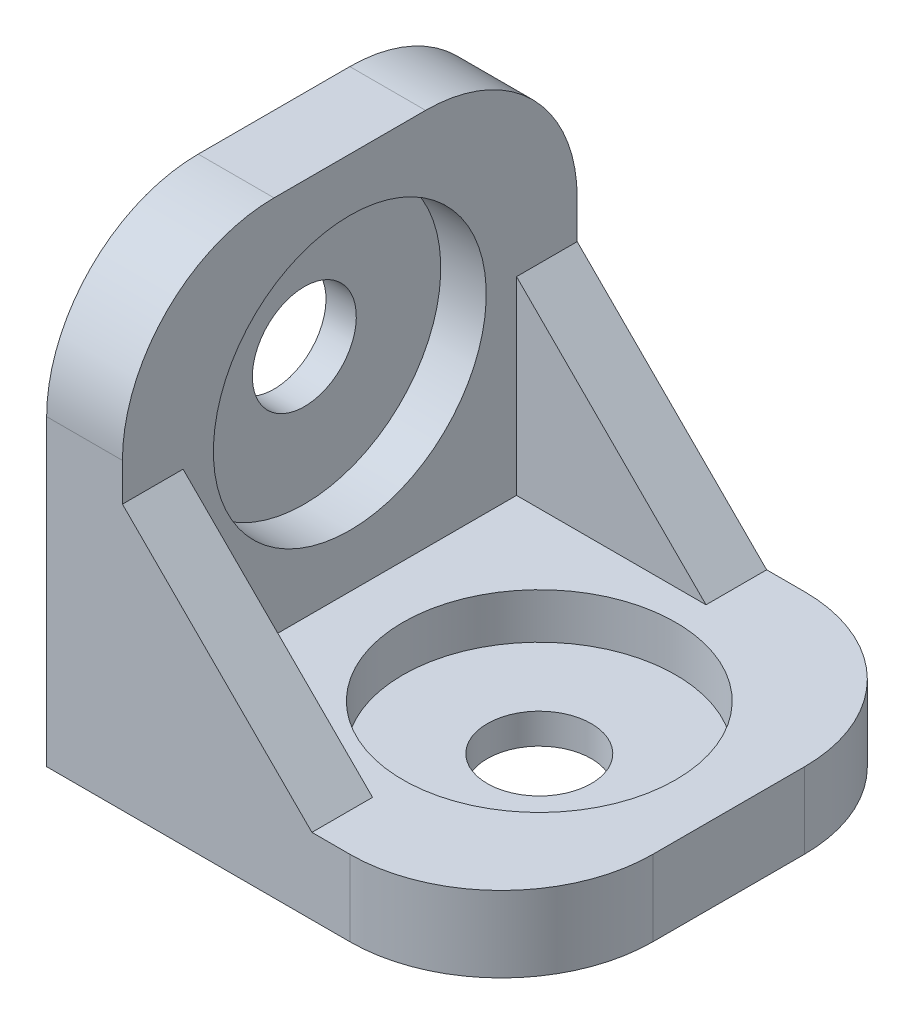
ISO-10303-21;
HEADER;
FILE_DESCRIPTION(('STEP AP214'),'2;1');
FILE_NAME('part.step','',(''),(''),'','','');
FILE_SCHEMA(('AUTOMOTIVE_DESIGN { 1 0 10303 214 1 1 1 1 }'));
ENDSEC;
DATA;
#1=APPLICATION_CONTEXT('core data for automotive mechanical design processes');
#2=APPLICATION_PROTOCOL_DEFINITION('international standard','automotive_design',2000,#1);
#3=PRODUCT_CONTEXT('',#1,'mechanical');
#4=PRODUCT('Part','Part','',(#3));
#5=PRODUCT_RELATED_PRODUCT_CATEGORY('part','',(#4));
#6=PRODUCT_DEFINITION_FORMATION('','',#4);
#7=PRODUCT_DEFINITION_CONTEXT('part definition',#1,'design');
#8=PRODUCT_DEFINITION('design','',#6,#7);
#9=PRODUCT_DEFINITION_SHAPE('','',#8);
#10=(LENGTH_UNIT() NAMED_UNIT(*) SI_UNIT(.MILLI.,.METRE.));
#11=(NAMED_UNIT(*) PLANE_ANGLE_UNIT() SI_UNIT($,.RADIAN.));
#12=(NAMED_UNIT(*) SI_UNIT($,.STERADIAN.) SOLID_ANGLE_UNIT());
#13=UNCERTAINTY_MEASURE_WITH_UNIT(LENGTH_MEASURE(1.E-05),#10,'distance_accuracy_value','');
#14=(GEOMETRIC_REPRESENTATION_CONTEXT(3) GLOBAL_UNCERTAINTY_ASSIGNED_CONTEXT((#13)) GLOBAL_UNIT_ASSIGNED_CONTEXT((#10,
#11,#12)) REPRESENTATION_CONTEXT('',''));
#15=CARTESIAN_POINT('',(0.,0.,0.));
#16=DIRECTION('',(0.,0.,1.));
#17=DIRECTION('',(1.,0.,0.));
#18=AXIS2_PLACEMENT_3D('',#15,#16,#17);
#19=CARTESIAN_POINT('',(0.,17.5,15.));
#20=DIRECTION('',(1.,0.,0.));
#21=DIRECTION('',(0.,1.,0.));
#22=AXIS2_PLACEMENT_3D('',#19,#20,#21);
#23=CYLINDRICAL_SURFACE('',#22,3.429);
#24=CARTESIAN_POINT('',(0.,17.5,15.));
#25=DIRECTION('',(1.,0.,0.));
#26=DIRECTION('',(0.,1.,0.));
#27=AXIS2_PLACEMENT_3D('',#24,#25,#26);
#28=CIRCLE('',#27,3.429);
#29=CARTESIAN_POINT('',(0.,20.929,15.));
#30=VERTEX_POINT('',#29);
#31=EDGE_CURVE('E242',#30,#30,#28,.T.);
#32=ORIENTED_EDGE('',*,*,#31,.F.);
#33=EDGE_LOOP('',(#32));
#34=FACE_BOUND('',#33,.T.);
#35=CARTESIAN_POINT('',(2.,17.5,15.));
#36=DIRECTION('',(1.,0.,0.));
#37=DIRECTION('',(0.,1.,0.));
#38=AXIS2_PLACEMENT_3D('',#35,#36,#37);
#39=CIRCLE('',#38,3.429);
#40=CARTESIAN_POINT('',(2.,20.929,15.));
#41=VERTEX_POINT('',#40);
#42=EDGE_CURVE('E180',#41,#41,#39,.F.);
#43=ORIENTED_EDGE('',*,*,#42,.F.);
#44=EDGE_LOOP('',(#43));
#45=FACE_BOUND('',#44,.T.);
#46=ADVANCED_FACE('F33',(#34,#45),#23,.F.);
#47=CARTESIAN_POINT('',(17.5,0.,15.));
#48=DIRECTION('',(0.,1.,0.));
#49=DIRECTION('',(-1.,0.,0.));
#50=AXIS2_PLACEMENT_3D('',#47,#48,#49);
#51=CYLINDRICAL_SURFACE('',#50,3.429);
#52=CARTESIAN_POINT('',(17.5,0.,15.));
#53=DIRECTION('',(0.,1.,0.));
#54=DIRECTION('',(-1.,0.,0.));
#55=AXIS2_PLACEMENT_3D('',#52,#53,#54);
#56=CIRCLE('',#55,3.429);
#57=CARTESIAN_POINT('',(14.071,0.,15.));
#58=VERTEX_POINT('',#57);
#59=EDGE_CURVE('E178',#58,#58,#56,.T.);
#60=ORIENTED_EDGE('',*,*,#59,.F.);
#61=EDGE_LOOP('',(#60));
#62=FACE_BOUND('',#61,.T.);
#63=CARTESIAN_POINT('',(17.5,2.,15.));
#64=DIRECTION('',(0.,1.,0.));
#65=DIRECTION('',(-1.,0.,0.));
#66=AXIS2_PLACEMENT_3D('',#63,#64,#65);
#67=CIRCLE('',#66,3.429);
#68=CARTESIAN_POINT('',(14.071,2.,15.));
#69=VERTEX_POINT('',#68);
#70=EDGE_CURVE('E175',#69,#69,#67,.F.);
#71=ORIENTED_EDGE('',*,*,#70,.F.);
#72=EDGE_LOOP('',(#71));
#73=FACE_BOUND('',#72,.T.);
#74=ADVANCED_FACE('F322',(#62,#73),#51,.F.);
#75=CARTESIAN_POINT('',(5.,30.,30.));
#76=DIRECTION('',(0.,-1.,0.));
#77=DIRECTION('',(0.,0.,-1.));
#78=AXIS2_PLACEMENT_3D('',#75,#76,#77);
#79=PLANE('',#78);
#80=DIRECTION('',(0.,0.,-1.));
#81=VECTOR('',#80,1.);
#82=CARTESIAN_POINT('',(0.,30.,30.));
#83=LINE('',#82,#81);
#84=CARTESIAN_POINT('',(0.,30.,20.));
#85=VERTEX_POINT('',#84);
#86=CARTESIAN_POINT('',(0.,30.,10.));
#87=VERTEX_POINT('',#86);
#88=EDGE_CURVE('E171',#85,#87,#83,.T.);
#89=ORIENTED_EDGE('',*,*,#88,.F.);
#90=DIRECTION('',(-1.,0.,0.));
#91=VECTOR('',#90,1.);
#92=CARTESIAN_POINT('',(5.,30.,20.));
#93=LINE('',#92,#91);
#94=CARTESIAN_POINT('',(5.,30.,20.));
#95=VERTEX_POINT('',#94);
#96=EDGE_CURVE('E54',#85,#95,#93,.F.);
#97=ORIENTED_EDGE('',*,*,#96,.T.);
#98=DIRECTION('',(0.,0.,-1.));
#99=VECTOR('',#98,1.);
#100=CARTESIAN_POINT('',(5.,30.,30.));
#101=LINE('',#100,#99);
#102=CARTESIAN_POINT('',(5.,30.,10.));
#103=VERTEX_POINT('',#102);
#104=EDGE_CURVE('E158',#95,#103,#101,.T.);
#105=ORIENTED_EDGE('',*,*,#104,.T.);
#106=DIRECTION('',(-1.,0.,0.));
#107=VECTOR('',#106,1.);
#108=CARTESIAN_POINT('',(5.,30.,10.));
#109=LINE('',#108,#107);
#110=EDGE_CURVE('E211',#103,#87,#109,.T.);
#111=ORIENTED_EDGE('',*,*,#110,.T.);
#112=EDGE_LOOP('',(#89,#97,#105,#111));
#113=FACE_BOUND('',#112,.T.);
#114=ADVANCED_FACE('F215',(#113),#79,.F.);
#115=CARTESIAN_POINT('',(0.,30.,30.));
#116=DIRECTION('',(1.,0.,0.));
#117=DIRECTION('',(0.,1.,0.));
#118=AXIS2_PLACEMENT_3D('',#115,#116,#117);
#119=PLANE('',#118);
#120=ORIENTED_EDGE('',*,*,#31,.T.);
#121=EDGE_LOOP('',(#120));
#122=FACE_BOUND('',#121,.T.);
#123=DIRECTION('',(0.,-1.,0.));
#124=VECTOR('',#123,1.);
#125=CARTESIAN_POINT('',(0.,30.,30.));
#126=LINE('',#125,#124);
#127=CARTESIAN_POINT('',(0.,20.,30.));
#128=VERTEX_POINT('',#127);
#129=CARTESIAN_POINT('',(0.,0.,30.));
#130=VERTEX_POINT('',#129);
#131=EDGE_CURVE('E222',#128,#130,#126,.T.);
#132=ORIENTED_EDGE('',*,*,#131,.F.);
#133=CARTESIAN_POINT('',(0.,20.,20.));
#134=DIRECTION('',(1.,0.,0.));
#135=DIRECTION('',(0.,1.,0.));
#136=AXIS2_PLACEMENT_3D('',#133,#134,#135);
#137=CIRCLE('',#136,10.);
#138=EDGE_CURVE('E209',#128,#85,#137,.F.);
#139=ORIENTED_EDGE('',*,*,#138,.T.);
#140=ORIENTED_EDGE('',*,*,#88,.T.);
#141=CARTESIAN_POINT('',(0.,20.,10.));
#142=DIRECTION('',(1.,0.,0.));
#143=DIRECTION('',(0.,1.,0.));
#144=AXIS2_PLACEMENT_3D('',#141,#142,#143);
#145=CIRCLE('',#144,10.);
#146=CARTESIAN_POINT('',(0.,20.,0.));
#147=VERTEX_POINT('',#146);
#148=EDGE_CURVE('E207',#87,#147,#145,.F.);
#149=ORIENTED_EDGE('',*,*,#148,.T.);
#150=DIRECTION('',(0.,-1.,0.));
#151=VECTOR('',#150,1.);
#152=CARTESIAN_POINT('',(0.,30.,0.));
#153=LINE('',#152,#151);
#154=CARTESIAN_POINT('',(0.,0.,0.));
#155=VERTEX_POINT('',#154);
#156=EDGE_CURVE('E239',#147,#155,#153,.T.);
#157=ORIENTED_EDGE('',*,*,#156,.T.);
#158=DIRECTION('',(0.,0.,-1.));
#159=VECTOR('',#158,1.);
#160=CARTESIAN_POINT('',(0.,0.,30.));
#161=LINE('',#160,#159);
#162=EDGE_CURVE('E168',#130,#155,#161,.T.);
#163=ORIENTED_EDGE('',*,*,#162,.F.);
#164=EDGE_LOOP('',(#132,#139,#140,#149,#157,#163));
#165=FACE_BOUND('',#164,.T.);
#166=ADVANCED_FACE('F219',(#122,#165),#119,.F.);
#167=CARTESIAN_POINT('',(0.,0.,30.));
#168=DIRECTION('',(0.,1.,0.));
#169=DIRECTION('',(0.,0.,1.));
#170=AXIS2_PLACEMENT_3D('',#167,#168,#169);
#171=PLANE('',#170);
#172=ORIENTED_EDGE('',*,*,#59,.T.);
#173=EDGE_LOOP('',(#172));
#174=FACE_BOUND('',#173,.T.);
#175=DIRECTION('',(1.,0.,0.));
#176=VECTOR('',#175,1.);
#177=CARTESIAN_POINT('',(0.,0.,0.));
#178=LINE('',#177,#176);
#179=CARTESIAN_POINT('',(20.,0.,0.));
#180=VERTEX_POINT('',#179);
#181=EDGE_CURVE('E241',#155,#180,#178,.T.);
#182=ORIENTED_EDGE('',*,*,#181,.T.);
#183=CARTESIAN_POINT('',(20.,0.,10.));
#184=DIRECTION('',(0.,1.,0.));
#185=DIRECTION('',(0.,0.,1.));
#186=AXIS2_PLACEMENT_3D('',#183,#184,#185);
#187=CIRCLE('',#186,10.);
#188=CARTESIAN_POINT('',(30.,0.,10.));
#189=VERTEX_POINT('',#188);
#190=EDGE_CURVE('E199',#180,#189,#187,.F.);
#191=ORIENTED_EDGE('',*,*,#190,.T.);
#192=DIRECTION('',(0.,0.,-1.));
#193=VECTOR('',#192,1.);
#194=CARTESIAN_POINT('',(30.,0.,30.));
#195=LINE('',#194,#193);
#196=CARTESIAN_POINT('',(30.,0.,20.));
#197=VERTEX_POINT('',#196);
#198=EDGE_CURVE('E160',#197,#189,#195,.T.);
#199=ORIENTED_EDGE('',*,*,#198,.F.);
#200=CARTESIAN_POINT('',(20.,0.,20.));
#201=DIRECTION('',(0.,1.,0.));
#202=DIRECTION('',(0.,0.,1.));
#203=AXIS2_PLACEMENT_3D('',#200,#201,#202);
#204=CIRCLE('',#203,10.);
#205=CARTESIAN_POINT('',(20.,0.,30.));
#206=VERTEX_POINT('',#205);
#207=EDGE_CURVE('E197',#197,#206,#204,.F.);
#208=ORIENTED_EDGE('',*,*,#207,.T.);
#209=DIRECTION('',(1.,0.,0.));
#210=VECTOR('',#209,1.);
#211=CARTESIAN_POINT('',(0.,0.,30.));
#212=LINE('',#211,#210);
#213=EDGE_CURVE('E235',#130,#206,#212,.T.);
#214=ORIENTED_EDGE('',*,*,#213,.F.);
#215=ORIENTED_EDGE('',*,*,#162,.T.);
#216=EDGE_LOOP('',(#182,#191,#199,#208,#214,#215));
#217=FACE_BOUND('',#216,.T.);
#218=ADVANCED_FACE('F296',(#174,#217),#171,.F.);
#219=CARTESIAN_POINT('',(30.,0.,30.));
#220=DIRECTION('',(-1.,0.,0.));
#221=DIRECTION('',(0.,0.,1.));
#222=AXIS2_PLACEMENT_3D('',#219,#220,#221);
#223=PLANE('',#222);
#224=ORIENTED_EDGE('',*,*,#198,.T.);
#225=DIRECTION('',(0.,1.,0.));
#226=VECTOR('',#225,1.);
#227=CARTESIAN_POINT('',(30.,0.,10.));
#228=LINE('',#227,#226);
#229=CARTESIAN_POINT('',(30.,5.,10.));
#230=VERTEX_POINT('',#229);
#231=EDGE_CURVE('E186',#189,#230,#228,.T.);
#232=ORIENTED_EDGE('',*,*,#231,.T.);
#233=DIRECTION('',(0.,0.,-1.));
#234=VECTOR('',#233,1.);
#235=CARTESIAN_POINT('',(30.,5.,30.));
#236=LINE('',#235,#234);
#237=CARTESIAN_POINT('',(30.,5.,20.));
#238=VERTEX_POINT('',#237);
#239=EDGE_CURVE('E157',#238,#230,#236,.T.);
#240=ORIENTED_EDGE('',*,*,#239,.F.);
#241=DIRECTION('',(0.,1.,0.));
#242=VECTOR('',#241,1.);
#243=CARTESIAN_POINT('',(30.,0.,20.));
#244=LINE('',#243,#242);
#245=EDGE_CURVE('E174',#238,#197,#244,.F.);
#246=ORIENTED_EDGE('',*,*,#245,.T.);
#247=EDGE_LOOP('',(#224,#232,#240,#246));
#248=FACE_BOUND('',#247,.T.);
#249=ADVANCED_FACE('F293',(#248),#223,.F.);
#250=CARTESIAN_POINT('',(30.,5.,30.));
#251=DIRECTION('',(0.,-1.,0.));
#252=DIRECTION('',(1.,0.,0.));
#253=AXIS2_PLACEMENT_3D('',#250,#251,#252);
#254=PLANE('',#253);
#255=CARTESIAN_POINT('',(17.5,5.,15.));
#256=DIRECTION('',(0.,1.,0.));
#257=DIRECTION('',(-1.,0.,0.));
#258=AXIS2_PLACEMENT_3D('',#255,#256,#257);
#259=CIRCLE('',#258,9.);
#260=CARTESIAN_POINT('',(8.5,5.,15.));
#261=VERTEX_POINT('',#260);
#262=EDGE_CURVE('E183',#261,#261,#259,.T.);
#263=ORIENTED_EDGE('',*,*,#262,.F.);
#264=EDGE_LOOP('',(#263));
#265=FACE_BOUND('',#264,.T.);
#266=ORIENTED_EDGE('',*,*,#239,.T.);
#267=CARTESIAN_POINT('',(20.,5.,10.));
#268=DIRECTION('',(0.,-1.,0.));
#269=DIRECTION('',(1.,0.,0.));
#270=AXIS2_PLACEMENT_3D('',#267,#268,#269);
#271=CIRCLE('',#270,10.);
#272=CARTESIAN_POINT('',(20.,5.,0.));
#273=VERTEX_POINT('',#272);
#274=EDGE_CURVE('E191',#230,#273,#271,.F.);
#275=ORIENTED_EDGE('',*,*,#274,.T.);
#276=DIRECTION('',(-1.,0.,0.));
#277=VECTOR('',#276,1.);
#278=CARTESIAN_POINT('',(30.,5.,0.));
#279=LINE('',#278,#277);
#280=CARTESIAN_POINT('',(17.5,5.,0.));
#281=VERTEX_POINT('',#280);
#282=EDGE_CURVE('E245',#273,#281,#279,.T.);
#283=ORIENTED_EDGE('',*,*,#282,.T.);
#284=DIRECTION('',(0.,0.,-1.));
#285=VECTOR('',#284,1.);
#286=CARTESIAN_POINT('',(17.5,5.,4.));
#287=LINE('',#286,#285);
#288=CARTESIAN_POINT('',(17.5,5.,4.));
#289=VERTEX_POINT('',#288);
#290=EDGE_CURVE('E261',#289,#281,#287,.T.);
#291=ORIENTED_EDGE('',*,*,#290,.F.);
#292=DIRECTION('',(-1.,0.,0.));
#293=VECTOR('',#292,1.);
#294=CARTESIAN_POINT('',(17.5,5.,4.));
#295=LINE('',#294,#293);
#296=CARTESIAN_POINT('',(5.,5.,4.));
#297=VERTEX_POINT('',#296);
#298=EDGE_CURVE('E155',#289,#297,#295,.T.);
#299=ORIENTED_EDGE('',*,*,#298,.T.);
#300=DIRECTION('',(0.,0.,-1.));
#301=VECTOR('',#300,1.);
#302=CARTESIAN_POINT('',(5.,5.,30.));
#303=LINE('',#302,#301);
#304=CARTESIAN_POINT('',(5.,5.,26.));
#305=VERTEX_POINT('',#304);
#306=EDGE_CURVE('E146',#305,#297,#303,.T.);
#307=ORIENTED_EDGE('',*,*,#306,.F.);
#308=DIRECTION('',(1.,0.,0.));
#309=VECTOR('',#308,1.);
#310=CARTESIAN_POINT('',(5.,5.,26.));
#311=LINE('',#310,#309);
#312=CARTESIAN_POINT('',(17.5,5.,26.));
#313=VERTEX_POINT('',#312);
#314=EDGE_CURVE('E134',#305,#313,#311,.T.);
#315=ORIENTED_EDGE('',*,*,#314,.T.);
#316=DIRECTION('',(0.,0.,1.));
#317=VECTOR('',#316,1.);
#318=CARTESIAN_POINT('',(17.5,5.,26.));
#319=LINE('',#318,#317);
#320=CARTESIAN_POINT('',(17.5,5.,30.));
#321=VERTEX_POINT('',#320);
#322=EDGE_CURVE('E277',#313,#321,#319,.T.);
#323=ORIENTED_EDGE('',*,*,#322,.T.);
#324=DIRECTION('',(-1.,0.,0.));
#325=VECTOR('',#324,1.);
#326=CARTESIAN_POINT('',(30.,5.,30.));
#327=LINE('',#326,#325);
#328=CARTESIAN_POINT('',(20.,5.,30.));
#329=VERTEX_POINT('',#328);
#330=EDGE_CURVE('E233',#329,#321,#327,.T.);
#331=ORIENTED_EDGE('',*,*,#330,.F.);
#332=CARTESIAN_POINT('',(20.,5.,20.));
#333=DIRECTION('',(0.,-1.,0.));
#334=DIRECTION('',(1.,0.,0.));
#335=AXIS2_PLACEMENT_3D('',#332,#333,#334);
#336=CIRCLE('',#335,10.);
#337=EDGE_CURVE('E189',#329,#238,#336,.F.);
#338=ORIENTED_EDGE('',*,*,#337,.T.);
#339=EDGE_LOOP('',(#266,#275,#283,#291,#299,#307,#315,#323,#331,#338));
#340=FACE_BOUND('',#339,.T.);
#341=ADVANCED_FACE('F153',(#265,#340),#254,.F.);
#342=CARTESIAN_POINT('',(5.,5.,30.));
#343=DIRECTION('',(-1.,0.,0.));
#344=DIRECTION('',(0.,-1.,0.));
#345=AXIS2_PLACEMENT_3D('',#342,#343,#344);
#346=PLANE('',#345);
#347=CARTESIAN_POINT('',(5.,17.5,15.));
#348=DIRECTION('',(1.,0.,0.));
#349=DIRECTION('',(0.,1.,0.));
#350=AXIS2_PLACEMENT_3D('',#347,#348,#349);
#351=CIRCLE('',#350,9.);
#352=CARTESIAN_POINT('',(5.,26.5,15.));
#353=VERTEX_POINT('',#352);
#354=EDGE_CURVE('E258',#353,#353,#351,.T.);
#355=ORIENTED_EDGE('',*,*,#354,.F.);
#356=EDGE_LOOP('',(#355));
#357=FACE_BOUND('',#356,.T.);
#358=ORIENTED_EDGE('',*,*,#104,.F.);
#359=CARTESIAN_POINT('',(5.,20.,20.));
#360=DIRECTION('',(-1.,0.,0.));
#361=DIRECTION('',(0.,-1.,0.));
#362=AXIS2_PLACEMENT_3D('',#359,#360,#361);
#363=CIRCLE('',#362,10.);
#364=CARTESIAN_POINT('',(5.,20.,30.));
#365=VERTEX_POINT('',#364);
#366=EDGE_CURVE('E11',#95,#365,#363,.F.);
#367=ORIENTED_EDGE('',*,*,#366,.T.);
#368=DIRECTION('',(0.,1.,0.));
#369=VECTOR('',#368,1.);
#370=CARTESIAN_POINT('',(5.,5.,30.));
#371=LINE('',#370,#369);
#372=CARTESIAN_POINT('',(5.,17.5,30.));
#373=VERTEX_POINT('',#372);
#374=EDGE_CURVE('E162',#373,#365,#371,.T.);
#375=ORIENTED_EDGE('',*,*,#374,.F.);
#376=DIRECTION('',(0.,0.,1.));
#377=VECTOR('',#376,1.);
#378=CARTESIAN_POINT('',(5.,17.5,26.));
#379=LINE('',#378,#377);
#380=CARTESIAN_POINT('',(5.,17.5,26.));
#381=VERTEX_POINT('',#380);
#382=EDGE_CURVE('E149',#381,#373,#379,.T.);
#383=ORIENTED_EDGE('',*,*,#382,.F.);
#384=DIRECTION('',(0.,-1.,0.));
#385=VECTOR('',#384,1.);
#386=CARTESIAN_POINT('',(5.,17.5,26.));
#387=LINE('',#386,#385);
#388=EDGE_CURVE('E137',#381,#305,#387,.T.);
#389=ORIENTED_EDGE('',*,*,#388,.T.);
#390=ORIENTED_EDGE('',*,*,#306,.T.);
#391=DIRECTION('',(0.,1.,0.));
#392=VECTOR('',#391,1.);
#393=CARTESIAN_POINT('',(5.,5.,4.));
#394=LINE('',#393,#392);
#395=CARTESIAN_POINT('',(5.,17.5,4.));
#396=VERTEX_POINT('',#395);
#397=EDGE_CURVE('E274',#297,#396,#394,.T.);
#398=ORIENTED_EDGE('',*,*,#397,.T.);
#399=DIRECTION('',(0.,0.,-1.));
#400=VECTOR('',#399,1.);
#401=CARTESIAN_POINT('',(5.,17.5,4.));
#402=LINE('',#401,#400);
#403=CARTESIAN_POINT('',(5.,17.5,0.));
#404=VERTEX_POINT('',#403);
#405=EDGE_CURVE('E264',#396,#404,#402,.T.);
#406=ORIENTED_EDGE('',*,*,#405,.T.);
#407=DIRECTION('',(0.,1.,0.));
#408=VECTOR('',#407,1.);
#409=CARTESIAN_POINT('',(5.,5.,0.));
#410=LINE('',#409,#408);
#411=CARTESIAN_POINT('',(5.,20.,0.));
#412=VERTEX_POINT('',#411);
#413=EDGE_CURVE('E246',#404,#412,#410,.T.);
#414=ORIENTED_EDGE('',*,*,#413,.T.);
#415=CARTESIAN_POINT('',(5.,20.,10.));
#416=DIRECTION('',(-1.,0.,0.));
#417=DIRECTION('',(0.,-1.,0.));
#418=AXIS2_PLACEMENT_3D('',#415,#416,#417);
#419=CIRCLE('',#418,10.);
#420=EDGE_CURVE('E41',#412,#103,#419,.F.);
#421=ORIENTED_EDGE('',*,*,#420,.T.);
#422=EDGE_LOOP('',(#358,#367,#375,#383,#389,#390,#398,#406,#414,#421));
#423=FACE_BOUND('',#422,.T.);
#424=ADVANCED_FACE('F145',(#357,#423),#346,.F.);
#425=CARTESIAN_POINT('',(0.,0.,30.));
#426=DIRECTION('',(0.,0.,1.));
#427=DIRECTION('',(1.,0.,0.));
#428=AXIS2_PLACEMENT_3D('',#425,#426,#427);
#429=PLANE('',#428);
#430=ORIENTED_EDGE('',*,*,#213,.T.);
#431=DIRECTION('',(0.,1.,0.));
#432=VECTOR('',#431,1.);
#433=CARTESIAN_POINT('',(20.,5.,30.));
#434=LINE('',#433,#432);
#435=EDGE_CURVE('E204',#206,#329,#434,.T.);
#436=ORIENTED_EDGE('',*,*,#435,.T.);
#437=ORIENTED_EDGE('',*,*,#330,.T.);
#438=DIRECTION('',(-0.707106781186548,0.707106781186547,0.));
#439=VECTOR('',#438,1.);
#440=CARTESIAN_POINT('',(17.5,5.,30.));
#441=LINE('',#440,#439);
#442=EDGE_CURVE('E150',#321,#373,#441,.T.);
#443=ORIENTED_EDGE('',*,*,#442,.T.);
#444=ORIENTED_EDGE('',*,*,#374,.T.);
#445=DIRECTION('',(-1.,0.,0.));
#446=VECTOR('',#445,1.);
#447=CARTESIAN_POINT('',(0.,20.,30.));
#448=LINE('',#447,#446);
#449=EDGE_CURVE('E201',#365,#128,#448,.T.);
#450=ORIENTED_EDGE('',*,*,#449,.T.);
#451=ORIENTED_EDGE('',*,*,#131,.T.);
#452=EDGE_LOOP('',(#430,#436,#437,#443,#444,#450,#451));
#453=FACE_BOUND('',#452,.T.);
#454=ADVANCED_FACE('F230',(#453),#429,.T.);
#455=CARTESIAN_POINT('',(0.,0.,0.));
#456=DIRECTION('',(0.,0.,1.));
#457=DIRECTION('',(1.,0.,0.));
#458=AXIS2_PLACEMENT_3D('',#455,#456,#457);
#459=PLANE('',#458);
#460=ORIENTED_EDGE('',*,*,#282,.F.);
#461=DIRECTION('',(0.,1.,0.));
#462=VECTOR('',#461,1.);
#463=CARTESIAN_POINT('',(20.,0.,0.));
#464=LINE('',#463,#462);
#465=EDGE_CURVE('E195',#273,#180,#464,.F.);
#466=ORIENTED_EDGE('',*,*,#465,.T.);
#467=ORIENTED_EDGE('',*,*,#181,.F.);
#468=ORIENTED_EDGE('',*,*,#156,.F.);
#469=DIRECTION('',(-1.,0.,0.));
#470=VECTOR('',#469,1.);
#471=CARTESIAN_POINT('',(0.,20.,0.));
#472=LINE('',#471,#470);
#473=EDGE_CURVE('E193',#147,#412,#472,.F.);
#474=ORIENTED_EDGE('',*,*,#473,.T.);
#475=ORIENTED_EDGE('',*,*,#413,.F.);
#476=DIRECTION('',(0.707106781186548,-0.707106781186547,0.));
#477=VECTOR('',#476,1.);
#478=CARTESIAN_POINT('',(17.5,5.,0.));
#479=LINE('',#478,#477);
#480=EDGE_CURVE('E269',#404,#281,#479,.T.);
#481=ORIENTED_EDGE('',*,*,#480,.T.);
#482=EDGE_LOOP('',(#460,#466,#467,#468,#474,#475,#481));
#483=FACE_BOUND('',#482,.T.);
#484=ADVANCED_FACE('F304',(#483),#459,.F.);
#485=CARTESIAN_POINT('',(17.5,2.,15.));
#486=DIRECTION('',(0.,1.,0.));
#487=DIRECTION('',(-1.,0.,0.));
#488=AXIS2_PLACEMENT_3D('',#485,#486,#487);
#489=PLANE('',#488);
#490=CARTESIAN_POINT('',(17.5,2.,15.));
#491=DIRECTION('',(0.,1.,0.));
#492=DIRECTION('',(-1.,0.,0.));
#493=AXIS2_PLACEMENT_3D('',#490,#491,#492);
#494=CIRCLE('',#493,9.);
#495=CARTESIAN_POINT('',(8.5,2.,15.));
#496=VERTEX_POINT('',#495);
#497=EDGE_CURVE('E179',#496,#496,#494,.T.);
#498=ORIENTED_EDGE('',*,*,#497,.T.);
#499=EDGE_LOOP('',(#498));
#500=FACE_BOUND('',#499,.T.);
#501=ORIENTED_EDGE('',*,*,#70,.T.);
#502=EDGE_LOOP('',(#501));
#503=FACE_BOUND('',#502,.T.);
#504=ADVANCED_FACE('F338',(#500,#503),#489,.T.);
#505=CARTESIAN_POINT('',(17.5,2.,15.));
#506=DIRECTION('',(0.,1.,0.));
#507=DIRECTION('',(-1.,0.,0.));
#508=AXIS2_PLACEMENT_3D('',#505,#506,#507);
#509=CYLINDRICAL_SURFACE('',#508,9.);
#510=ORIENTED_EDGE('',*,*,#497,.F.);
#511=EDGE_LOOP('',(#510));
#512=FACE_BOUND('',#511,.T.);
#513=ORIENTED_EDGE('',*,*,#262,.T.);
#514=EDGE_LOOP('',(#513));
#515=FACE_BOUND('',#514,.T.);
#516=ADVANCED_FACE('F474',(#512,#515),#509,.F.);
#517=CARTESIAN_POINT('',(2.,17.5,15.));
#518=DIRECTION('',(1.,0.,0.));
#519=DIRECTION('',(0.,1.,0.));
#520=AXIS2_PLACEMENT_3D('',#517,#518,#519);
#521=PLANE('',#520);
#522=CARTESIAN_POINT('',(2.,17.5,15.));
#523=DIRECTION('',(1.,0.,0.));
#524=DIRECTION('',(0.,1.,0.));
#525=AXIS2_PLACEMENT_3D('',#522,#523,#524);
#526=CIRCLE('',#525,9.);
#527=CARTESIAN_POINT('',(2.,26.5,15.));
#528=VERTEX_POINT('',#527);
#529=EDGE_CURVE('E184',#528,#528,#526,.T.);
#530=ORIENTED_EDGE('',*,*,#529,.T.);
#531=EDGE_LOOP('',(#530));
#532=FACE_BOUND('',#531,.T.);
#533=ORIENTED_EDGE('',*,*,#42,.T.);
#534=EDGE_LOOP('',(#533));
#535=FACE_BOUND('',#534,.T.);
#536=ADVANCED_FACE('F465',(#532,#535),#521,.T.);
#537=CARTESIAN_POINT('',(2.,17.5,15.));
#538=DIRECTION('',(1.,0.,0.));
#539=DIRECTION('',(0.,1.,0.));
#540=AXIS2_PLACEMENT_3D('',#537,#538,#539);
#541=CYLINDRICAL_SURFACE('',#540,9.);
#542=ORIENTED_EDGE('',*,*,#529,.F.);
#543=EDGE_LOOP('',(#542));
#544=FACE_BOUND('',#543,.T.);
#545=ORIENTED_EDGE('',*,*,#354,.T.);
#546=EDGE_LOOP('',(#545));
#547=FACE_BOUND('',#546,.T.);
#548=ADVANCED_FACE('F319',(#544,#547),#541,.F.);
#549=CARTESIAN_POINT('',(17.5,5.,4.));
#550=DIRECTION('',(0.707106781186547,0.707106781186548,0.));
#551=DIRECTION('',(-0.707106781186548,0.707106781186547,0.));
#552=AXIS2_PLACEMENT_3D('',#549,#550,#551);
#553=PLANE('',#552);
#554=ORIENTED_EDGE('',*,*,#480,.F.);
#555=ORIENTED_EDGE('',*,*,#405,.F.);
#556=DIRECTION('',(0.707106781186548,-0.707106781186547,0.));
#557=VECTOR('',#556,1.);
#558=CARTESIAN_POINT('',(17.5,5.,4.));
#559=LINE('',#558,#557);
#560=EDGE_CURVE('E266',#396,#289,#559,.T.);
#561=ORIENTED_EDGE('',*,*,#560,.T.);
#562=ORIENTED_EDGE('',*,*,#290,.T.);
#563=EDGE_LOOP('',(#554,#555,#561,#562));
#564=FACE_BOUND('',#563,.T.);
#565=ADVANCED_FACE('F308',(#564),#553,.T.);
#566=CARTESIAN_POINT('',(0.,0.,4.));
#567=DIRECTION('',(0.,0.,-1.));
#568=DIRECTION('',(-1.,0.,0.));
#569=AXIS2_PLACEMENT_3D('',#566,#567,#568);
#570=PLANE('',#569);
#571=ORIENTED_EDGE('',*,*,#298,.F.);
#572=ORIENTED_EDGE('',*,*,#560,.F.);
#573=ORIENTED_EDGE('',*,*,#397,.F.);
#574=EDGE_LOOP('',(#571,#572,#573));
#575=FACE_BOUND('',#574,.T.);
#576=ADVANCED_FACE('F311',(#575),#570,.F.);
#577=CARTESIAN_POINT('',(17.5,5.,26.));
#578=DIRECTION('',(0.707106781186547,0.707106781186548,0.));
#579=DIRECTION('',(-0.707106781186548,0.707106781186547,0.));
#580=AXIS2_PLACEMENT_3D('',#577,#578,#579);
#581=PLANE('',#580);
#582=ORIENTED_EDGE('',*,*,#442,.F.);
#583=ORIENTED_EDGE('',*,*,#322,.F.);
#584=DIRECTION('',(-0.707106781186548,0.707106781186547,0.));
#585=VECTOR('',#584,1.);
#586=CARTESIAN_POINT('',(17.5,5.,26.));
#587=LINE('',#586,#585);
#588=EDGE_CURVE('E139',#313,#381,#587,.T.);
#589=ORIENTED_EDGE('',*,*,#588,.T.);
#590=ORIENTED_EDGE('',*,*,#382,.T.);
#591=EDGE_LOOP('',(#582,#583,#589,#590));
#592=FACE_BOUND('',#591,.T.);
#593=ADVANCED_FACE('F282',(#592),#581,.T.);
#594=CARTESIAN_POINT('',(0.,0.,26.));
#595=DIRECTION('',(0.,0.,1.));
#596=DIRECTION('',(1.,0.,0.));
#597=AXIS2_PLACEMENT_3D('',#594,#595,#596);
#598=PLANE('',#597);
#599=ORIENTED_EDGE('',*,*,#388,.F.);
#600=ORIENTED_EDGE('',*,*,#588,.F.);
#601=ORIENTED_EDGE('',*,*,#314,.F.);
#602=EDGE_LOOP('',(#599,#600,#601));
#603=FACE_BOUND('',#602,.T.);
#604=ADVANCED_FACE('F136',(#603),#598,.F.);
#605=CARTESIAN_POINT('',(20.,0.,10.));
#606=DIRECTION('',(0.,1.,0.));
#607=DIRECTION('',(0.,0.,1.));
#608=AXIS2_PLACEMENT_3D('',#605,#606,#607);
#609=CYLINDRICAL_SURFACE('',#608,10.);
#610=ORIENTED_EDGE('',*,*,#190,.F.);
#611=ORIENTED_EDGE('',*,*,#465,.F.);
#612=ORIENTED_EDGE('',*,*,#274,.F.);
#613=ORIENTED_EDGE('',*,*,#231,.F.);
#614=EDGE_LOOP('',(#610,#611,#612,#613));
#615=FACE_BOUND('',#614,.T.);
#616=ADVANCED_FACE('F301',(#615),#609,.T.);
#617=CARTESIAN_POINT('',(20.,0.,20.));
#618=DIRECTION('',(0.,-1.,0.));
#619=DIRECTION('',(0.,0.,-1.));
#620=AXIS2_PLACEMENT_3D('',#617,#618,#619);
#621=CYLINDRICAL_SURFACE('',#620,10.);
#622=ORIENTED_EDGE('',*,*,#207,.F.);
#623=ORIENTED_EDGE('',*,*,#245,.F.);
#624=ORIENTED_EDGE('',*,*,#337,.F.);
#625=ORIENTED_EDGE('',*,*,#435,.F.);
#626=EDGE_LOOP('',(#622,#623,#624,#625));
#627=FACE_BOUND('',#626,.T.);
#628=ADVANCED_FACE('F289',(#627),#621,.T.);
#629=CARTESIAN_POINT('',(0.,20.,20.));
#630=DIRECTION('',(1.,0.,0.));
#631=DIRECTION('',(0.,0.,-1.));
#632=AXIS2_PLACEMENT_3D('',#629,#630,#631);
#633=CYLINDRICAL_SURFACE('',#632,10.);
#634=ORIENTED_EDGE('',*,*,#366,.F.);
#635=ORIENTED_EDGE('',*,*,#96,.F.);
#636=ORIENTED_EDGE('',*,*,#138,.F.);
#637=ORIENTED_EDGE('',*,*,#449,.F.);
#638=EDGE_LOOP('',(#634,#635,#636,#637));
#639=FACE_BOUND('',#638,.T.);
#640=ADVANCED_FACE('F226',(#639),#633,.T.);
#641=CARTESIAN_POINT('',(5.,20.,10.));
#642=DIRECTION('',(-1.,0.,0.));
#643=DIRECTION('',(0.,0.,1.));
#644=AXIS2_PLACEMENT_3D('',#641,#642,#643);
#645=CYLINDRICAL_SURFACE('',#644,10.);
#646=ORIENTED_EDGE('',*,*,#420,.F.);
#647=ORIENTED_EDGE('',*,*,#473,.F.);
#648=ORIENTED_EDGE('',*,*,#148,.F.);
#649=ORIENTED_EDGE('',*,*,#110,.F.);
#650=EDGE_LOOP('',(#646,#647,#648,#649));
#651=FACE_BOUND('',#650,.T.);
#652=ADVANCED_FACE('F35',(#651),#645,.T.);
#653=CLOSED_SHELL('',(#46,#74,#114,#166,#218,#249,#341,#424,#454,#484,#504,#516,#536,#548,#565,
#576,#593,#604,#616,#628,#640,#652));
#654=MANIFOLD_SOLID_BREP('B2',#653);
#655=ADVANCED_BREP_SHAPE_REPRESENTATION('',(#18,#654),#14);
#656=SHAPE_DEFINITION_REPRESENTATION(#9,#655);
ENDSEC;
END-ISO-10303-21;
